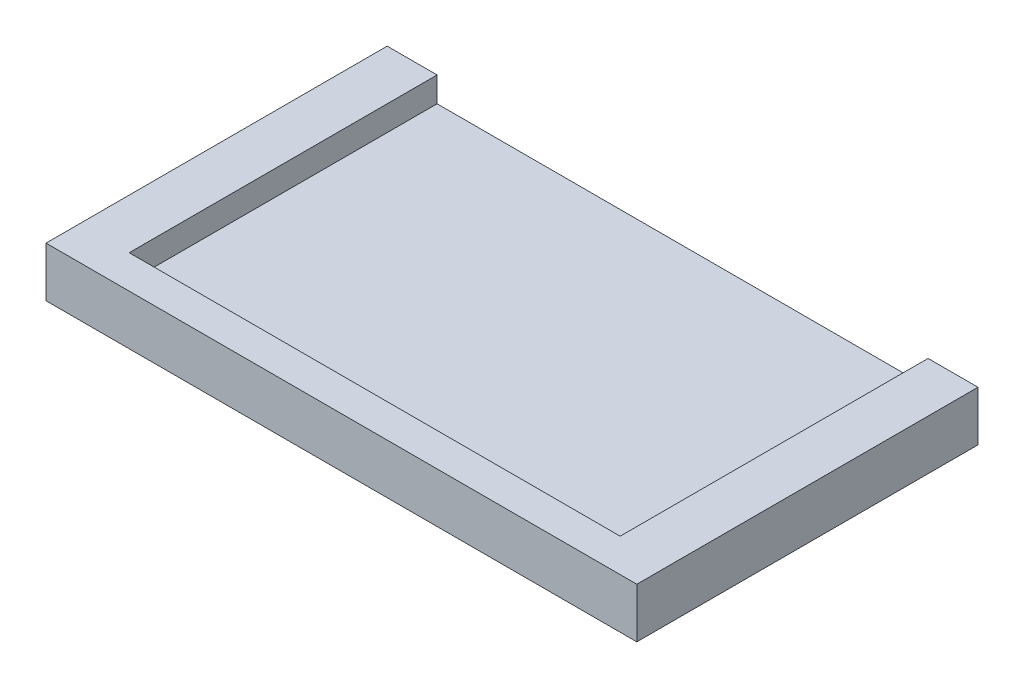
ISO-10303-21;
HEADER;
FILE_DESCRIPTION(('STEP AP214'),'2;1');
FILE_NAME('part.step','',(''),(''),'','','');
FILE_SCHEMA(('AUTOMOTIVE_DESIGN { 1 0 10303 214 1 1 1 1 }'));
ENDSEC;
DATA;
#1=APPLICATION_CONTEXT('core data for automotive mechanical design processes');
#2=APPLICATION_PROTOCOL_DEFINITION('international standard','automotive_design',2000,#1);
#3=PRODUCT_CONTEXT('',#1,'mechanical');
#4=PRODUCT('Part','Part','',(#3));
#5=PRODUCT_RELATED_PRODUCT_CATEGORY('part','',(#4));
#6=PRODUCT_DEFINITION_FORMATION('','',#4);
#7=PRODUCT_DEFINITION_CONTEXT('part definition',#1,'design');
#8=PRODUCT_DEFINITION('design','',#6,#7);
#9=PRODUCT_DEFINITION_SHAPE('','',#8);
#10=(LENGTH_UNIT() NAMED_UNIT(*) SI_UNIT(.MILLI.,.METRE.));
#11=(NAMED_UNIT(*) PLANE_ANGLE_UNIT() SI_UNIT($,.RADIAN.));
#12=(NAMED_UNIT(*) SI_UNIT($,.STERADIAN.) SOLID_ANGLE_UNIT());
#13=UNCERTAINTY_MEASURE_WITH_UNIT(LENGTH_MEASURE(1.E-05),#10,'distance_accuracy_value','');
#14=(GEOMETRIC_REPRESENTATION_CONTEXT(3) GLOBAL_UNCERTAINTY_ASSIGNED_CONTEXT((#13)) GLOBAL_UNIT_ASSIGNED_CONTEXT((#10,
#11,#12)) REPRESENTATION_CONTEXT('',''));
#15=CARTESIAN_POINT('',(0.,0.,0.));
#16=DIRECTION('',(0.,0.,1.));
#17=DIRECTION('',(1.,0.,0.));
#18=AXIS2_PLACEMENT_3D('',#15,#16,#17);
#19=CARTESIAN_POINT('',(-17.75,1.5,-10.25));
#20=DIRECTION('',(1.,0.,0.));
#21=DIRECTION('',(0.,0.,-1.));
#22=AXIS2_PLACEMENT_3D('',#19,#20,#21);
#23=PLANE('',#22);
#24=DIRECTION('',(0.,0.,1.));
#25=VECTOR('',#24,1.);
#26=CARTESIAN_POINT('',(-17.75,0.,-10.25));
#27=LINE('',#26,#25);
#28=CARTESIAN_POINT('',(-17.75,0.,-10.25));
#29=VERTEX_POINT('',#28);
#30=CARTESIAN_POINT('',(-17.75,0.,10.25));
#31=VERTEX_POINT('',#30);
#32=EDGE_CURVE('E156',#29,#31,#27,.T.);
#33=ORIENTED_EDGE('',*,*,#32,.T.);
#34=DIRECTION('',(0.,-1.,0.));
#35=VECTOR('',#34,1.);
#36=CARTESIAN_POINT('',(-17.75,1.5,10.25));
#37=LINE('',#36,#35);
#38=CARTESIAN_POINT('',(-17.75,3.,10.25));
#39=VERTEX_POINT('',#38);
#40=EDGE_CURVE('E11',#39,#31,#37,.T.);
#41=ORIENTED_EDGE('',*,*,#40,.F.);
#42=DIRECTION('',(0.,0.,1.));
#43=VECTOR('',#42,1.);
#44=CARTESIAN_POINT('',(-17.75,3.,-10.25));
#45=LINE('',#44,#43);
#46=CARTESIAN_POINT('',(-17.75,3.,-10.25));
#47=VERTEX_POINT('',#46);
#48=EDGE_CURVE('E139',#47,#39,#45,.T.);
#49=ORIENTED_EDGE('',*,*,#48,.F.);
#50=DIRECTION('',(0.,-1.,0.));
#51=VECTOR('',#50,1.);
#52=CARTESIAN_POINT('',(-17.75,1.5,-10.25));
#53=LINE('',#52,#51);
#54=EDGE_CURVE('E111',#47,#29,#53,.T.);
#55=ORIENTED_EDGE('',*,*,#54,.T.);
#56=EDGE_LOOP('',(#33,#41,#49,#55));
#57=FACE_BOUND('',#56,.T.);
#58=ADVANCED_FACE('F39',(#57),#23,.F.);
#59=CARTESIAN_POINT('',(-17.75,1.5,10.25));
#60=DIRECTION('',(0.,0.,-1.));
#61=DIRECTION('',(-1.,0.,0.));
#62=AXIS2_PLACEMENT_3D('',#59,#60,#61);
#63=PLANE('',#62);
#64=DIRECTION('',(1.,0.,0.));
#65=VECTOR('',#64,1.);
#66=CARTESIAN_POINT('',(-17.75,0.,10.25));
#67=LINE('',#66,#65);
#68=CARTESIAN_POINT('',(17.75,0.,10.25));
#69=VERTEX_POINT('',#68);
#70=EDGE_CURVE('E161',#31,#69,#67,.T.);
#71=ORIENTED_EDGE('',*,*,#70,.T.);
#72=DIRECTION('',(0.,-1.,0.));
#73=VECTOR('',#72,1.);
#74=CARTESIAN_POINT('',(17.75,1.5,10.25));
#75=LINE('',#74,#73);
#76=CARTESIAN_POINT('',(17.75,3.,10.25));
#77=VERTEX_POINT('',#76);
#78=EDGE_CURVE('E46',#77,#69,#75,.T.);
#79=ORIENTED_EDGE('',*,*,#78,.F.);
#80=DIRECTION('',(1.,0.,0.));
#81=VECTOR('',#80,1.);
#82=CARTESIAN_POINT('',(-17.75,3.,10.25));
#83=LINE('',#82,#81);
#84=EDGE_CURVE('E126',#39,#77,#83,.T.);
#85=ORIENTED_EDGE('',*,*,#84,.F.);
#86=ORIENTED_EDGE('',*,*,#40,.T.);
#87=EDGE_LOOP('',(#71,#79,#85,#86));
#88=FACE_BOUND('',#87,.T.);
#89=ADVANCED_FACE('F173',(#88),#63,.F.);
#90=CARTESIAN_POINT('',(17.75,1.5,-10.25));
#91=DIRECTION('',(-1.,0.,0.));
#92=DIRECTION('',(0.,0.,1.));
#93=AXIS2_PLACEMENT_3D('',#90,#91,#92);
#94=PLANE('',#93);
#95=DIRECTION('',(0.,0.,-1.));
#96=VECTOR('',#95,1.);
#97=CARTESIAN_POINT('',(17.75,0.,-10.25));
#98=LINE('',#97,#96);
#99=CARTESIAN_POINT('',(17.75,0.,-10.25));
#100=VERTEX_POINT('',#99);
#101=EDGE_CURVE('E108',#69,#100,#98,.T.);
#102=ORIENTED_EDGE('',*,*,#101,.T.);
#103=DIRECTION('',(0.,-1.,0.));
#104=VECTOR('',#103,1.);
#105=CARTESIAN_POINT('',(17.75,1.5,-10.25));
#106=LINE('',#105,#104);
#107=CARTESIAN_POINT('',(17.75,3.,-10.25));
#108=VERTEX_POINT('',#107);
#109=EDGE_CURVE('E101',#108,#100,#106,.T.);
#110=ORIENTED_EDGE('',*,*,#109,.F.);
#111=DIRECTION('',(0.,0.,-1.));
#112=VECTOR('',#111,1.);
#113=CARTESIAN_POINT('',(17.75,3.,10.25));
#114=LINE('',#113,#112);
#115=EDGE_CURVE('E106',#77,#108,#114,.T.);
#116=ORIENTED_EDGE('',*,*,#115,.F.);
#117=ORIENTED_EDGE('',*,*,#78,.T.);
#118=EDGE_LOOP('',(#102,#110,#116,#117));
#119=FACE_BOUND('',#118,.T.);
#120=ADVANCED_FACE('F103',(#119),#94,.F.);
#121=CARTESIAN_POINT('',(-17.75,1.5,-10.25));
#122=DIRECTION('',(0.,0.,1.));
#123=DIRECTION('',(1.,0.,0.));
#124=AXIS2_PLACEMENT_3D('',#121,#122,#123);
#125=PLANE('',#124);
#126=DIRECTION('',(-1.,0.,0.));
#127=VECTOR('',#126,1.);
#128=CARTESIAN_POINT('',(-17.75,0.,-10.25));
#129=LINE('',#128,#127);
#130=EDGE_CURVE('E158',#100,#29,#129,.T.);
#131=ORIENTED_EDGE('',*,*,#130,.T.);
#132=ORIENTED_EDGE('',*,*,#54,.F.);
#133=DIRECTION('',(-1.,0.,0.));
#134=VECTOR('',#133,1.);
#135=CARTESIAN_POINT('',(-14.75,3.,-10.25));
#136=LINE('',#135,#134);
#137=CARTESIAN_POINT('',(-14.75,3.,-10.25));
#138=VERTEX_POINT('',#137);
#139=EDGE_CURVE('E136',#138,#47,#136,.T.);
#140=ORIENTED_EDGE('',*,*,#139,.F.);
#141=DIRECTION('',(0.,-1.,0.));
#142=VECTOR('',#141,1.);
#143=CARTESIAN_POINT('',(-14.75,3.,-10.25));
#144=LINE('',#143,#142);
#145=CARTESIAN_POINT('',(-14.75,1.5,-10.25));
#146=VERTEX_POINT('',#145);
#147=EDGE_CURVE('E142',#138,#146,#144,.T.);
#148=ORIENTED_EDGE('',*,*,#147,.T.);
#149=DIRECTION('',(-1.,0.,0.));
#150=VECTOR('',#149,1.);
#151=CARTESIAN_POINT('',(-17.75,1.5,-10.25));
#152=LINE('',#151,#150);
#153=CARTESIAN_POINT('',(14.75,1.5,-10.25));
#154=VERTEX_POINT('',#153);
#155=EDGE_CURVE('E58',#154,#146,#152,.T.);
#156=ORIENTED_EDGE('',*,*,#155,.F.);
#157=DIRECTION('',(0.,-1.,0.));
#158=VECTOR('',#157,1.);
#159=CARTESIAN_POINT('',(14.75,3.,-10.25));
#160=LINE('',#159,#158);
#161=CARTESIAN_POINT('',(14.75,3.,-10.25));
#162=VERTEX_POINT('',#161);
#163=EDGE_CURVE('E117',#162,#154,#160,.T.);
#164=ORIENTED_EDGE('',*,*,#163,.F.);
#165=DIRECTION('',(-1.,0.,0.));
#166=VECTOR('',#165,1.);
#167=CARTESIAN_POINT('',(17.75,3.,-10.25));
#168=LINE('',#167,#166);
#169=EDGE_CURVE('E114',#108,#162,#168,.T.);
#170=ORIENTED_EDGE('',*,*,#169,.F.);
#171=ORIENTED_EDGE('',*,*,#109,.T.);
#172=EDGE_LOOP('',(#131,#132,#140,#148,#156,#164,#170,#171));
#173=FACE_BOUND('',#172,.T.);
#174=ADVANCED_FACE('F115',(#173),#125,.F.);
#175=CARTESIAN_POINT('',(0.,1.5,0.));
#176=DIRECTION('',(0.,1.,0.));
#177=DIRECTION('',(0.,0.,1.));
#178=AXIS2_PLACEMENT_3D('',#175,#176,#177);
#179=PLANE('',#178);
#180=DIRECTION('',(0.,0.,-1.));
#181=VECTOR('',#180,1.);
#182=CARTESIAN_POINT('',(-14.75,1.5,8.25));
#183=LINE('',#182,#181);
#184=CARTESIAN_POINT('',(-14.75,1.5,8.25));
#185=VERTEX_POINT('',#184);
#186=EDGE_CURVE('E53',#185,#146,#183,.T.);
#187=ORIENTED_EDGE('',*,*,#186,.F.);
#188=DIRECTION('',(-1.,0.,0.));
#189=VECTOR('',#188,1.);
#190=CARTESIAN_POINT('',(14.75,1.5,8.25));
#191=LINE('',#190,#189);
#192=CARTESIAN_POINT('',(14.75,1.5,8.25));
#193=VERTEX_POINT('',#192);
#194=EDGE_CURVE('E128',#193,#185,#191,.T.);
#195=ORIENTED_EDGE('',*,*,#194,.F.);
#196=DIRECTION('',(0.,0.,1.));
#197=VECTOR('',#196,1.);
#198=CARTESIAN_POINT('',(14.75,1.5,-10.25));
#199=LINE('',#198,#197);
#200=EDGE_CURVE('E143',#154,#193,#199,.T.);
#201=ORIENTED_EDGE('',*,*,#200,.F.);
#202=ORIENTED_EDGE('',*,*,#155,.T.);
#203=EDGE_LOOP('',(#187,#195,#201,#202));
#204=FACE_BOUND('',#203,.T.);
#205=ADVANCED_FACE('F183',(#204),#179,.T.);
#206=CARTESIAN_POINT('',(0.,0.,0.));
#207=DIRECTION('',(0.,1.,0.));
#208=DIRECTION('',(0.,0.,1.));
#209=AXIS2_PLACEMENT_3D('',#206,#207,#208);
#210=PLANE('',#209);
#211=ORIENTED_EDGE('',*,*,#32,.F.);
#212=ORIENTED_EDGE('',*,*,#130,.F.);
#213=ORIENTED_EDGE('',*,*,#101,.F.);
#214=ORIENTED_EDGE('',*,*,#70,.F.);
#215=EDGE_LOOP('',(#211,#212,#213,#214));
#216=FACE_BOUND('',#215,.T.);
#217=ADVANCED_FACE('F169',(#216),#210,.F.);
#218=CARTESIAN_POINT('',(14.75,3.,-10.25));
#219=DIRECTION('',(1.,0.,0.));
#220=DIRECTION('',(0.,0.,-1.));
#221=AXIS2_PLACEMENT_3D('',#218,#219,#220);
#222=PLANE('',#221);
#223=ORIENTED_EDGE('',*,*,#200,.T.);
#224=DIRECTION('',(0.,-1.,0.));
#225=VECTOR('',#224,1.);
#226=CARTESIAN_POINT('',(14.75,3.,8.25));
#227=LINE('',#226,#225);
#228=CARTESIAN_POINT('',(14.75,3.,8.25));
#229=VERTEX_POINT('',#228);
#230=EDGE_CURVE('E152',#229,#193,#227,.T.);
#231=ORIENTED_EDGE('',*,*,#230,.F.);
#232=DIRECTION('',(0.,0.,1.));
#233=VECTOR('',#232,1.);
#234=CARTESIAN_POINT('',(14.75,3.,-10.25));
#235=LINE('',#234,#233);
#236=EDGE_CURVE('E120',#162,#229,#235,.T.);
#237=ORIENTED_EDGE('',*,*,#236,.F.);
#238=ORIENTED_EDGE('',*,*,#163,.T.);
#239=EDGE_LOOP('',(#223,#231,#237,#238));
#240=FACE_BOUND('',#239,.T.);
#241=ADVANCED_FACE('F186',(#240),#222,.F.);
#242=CARTESIAN_POINT('',(14.75,3.,8.25));
#243=DIRECTION('',(0.,0.,1.));
#244=DIRECTION('',(1.,0.,0.));
#245=AXIS2_PLACEMENT_3D('',#242,#243,#244);
#246=PLANE('',#245);
#247=ORIENTED_EDGE('',*,*,#194,.T.);
#248=DIRECTION('',(0.,-1.,0.));
#249=VECTOR('',#248,1.);
#250=CARTESIAN_POINT('',(-14.75,3.,8.25));
#251=LINE('',#250,#249);
#252=CARTESIAN_POINT('',(-14.75,3.,8.25));
#253=VERTEX_POINT('',#252);
#254=EDGE_CURVE('E149',#253,#185,#251,.T.);
#255=ORIENTED_EDGE('',*,*,#254,.F.);
#256=DIRECTION('',(-1.,0.,0.));
#257=VECTOR('',#256,1.);
#258=CARTESIAN_POINT('',(14.75,3.,8.25));
#259=LINE('',#258,#257);
#260=EDGE_CURVE('E132',#229,#253,#259,.T.);
#261=ORIENTED_EDGE('',*,*,#260,.F.);
#262=ORIENTED_EDGE('',*,*,#230,.T.);
#263=EDGE_LOOP('',(#247,#255,#261,#262));
#264=FACE_BOUND('',#263,.T.);
#265=ADVANCED_FACE('F191',(#264),#246,.F.);
#266=CARTESIAN_POINT('',(-14.75,3.,8.25));
#267=DIRECTION('',(-1.,0.,0.));
#268=DIRECTION('',(0.,0.,1.));
#269=AXIS2_PLACEMENT_3D('',#266,#267,#268);
#270=PLANE('',#269);
#271=ORIENTED_EDGE('',*,*,#186,.T.);
#272=ORIENTED_EDGE('',*,*,#147,.F.);
#273=DIRECTION('',(0.,0.,-1.));
#274=VECTOR('',#273,1.);
#275=CARTESIAN_POINT('',(-14.75,3.,8.25));
#276=LINE('',#275,#274);
#277=EDGE_CURVE('E134',#253,#138,#276,.T.);
#278=ORIENTED_EDGE('',*,*,#277,.F.);
#279=ORIENTED_EDGE('',*,*,#254,.T.);
#280=EDGE_LOOP('',(#271,#272,#278,#279));
#281=FACE_BOUND('',#280,.T.);
#282=ADVANCED_FACE('F195',(#281),#270,.F.);
#283=CARTESIAN_POINT('',(0.,3.,0.));
#284=DIRECTION('',(0.,1.,0.));
#285=DIRECTION('',(0.,0.,1.));
#286=AXIS2_PLACEMENT_3D('',#283,#284,#285);
#287=PLANE('',#286);
#288=ORIENTED_EDGE('',*,*,#115,.T.);
#289=ORIENTED_EDGE('',*,*,#169,.T.);
#290=ORIENTED_EDGE('',*,*,#236,.T.);
#291=ORIENTED_EDGE('',*,*,#260,.T.);
#292=ORIENTED_EDGE('',*,*,#277,.T.);
#293=ORIENTED_EDGE('',*,*,#139,.T.);
#294=ORIENTED_EDGE('',*,*,#48,.T.);
#295=ORIENTED_EDGE('',*,*,#84,.T.);
#296=EDGE_LOOP('',(#288,#289,#290,#291,#292,#293,#294,#295));
#297=FACE_BOUND('',#296,.T.);
#298=ADVANCED_FACE('F123',(#297),#287,.T.);
#299=CLOSED_SHELL('',(#58,#89,#120,#174,#205,#217,#241,#265,#282,#298));
#300=MANIFOLD_SOLID_BREP('B2',#299);
#301=ADVANCED_BREP_SHAPE_REPRESENTATION('',(#18,#300),#14);
#302=SHAPE_DEFINITION_REPRESENTATION(#9,#301);
ENDSEC;
END-ISO-10303-21;
